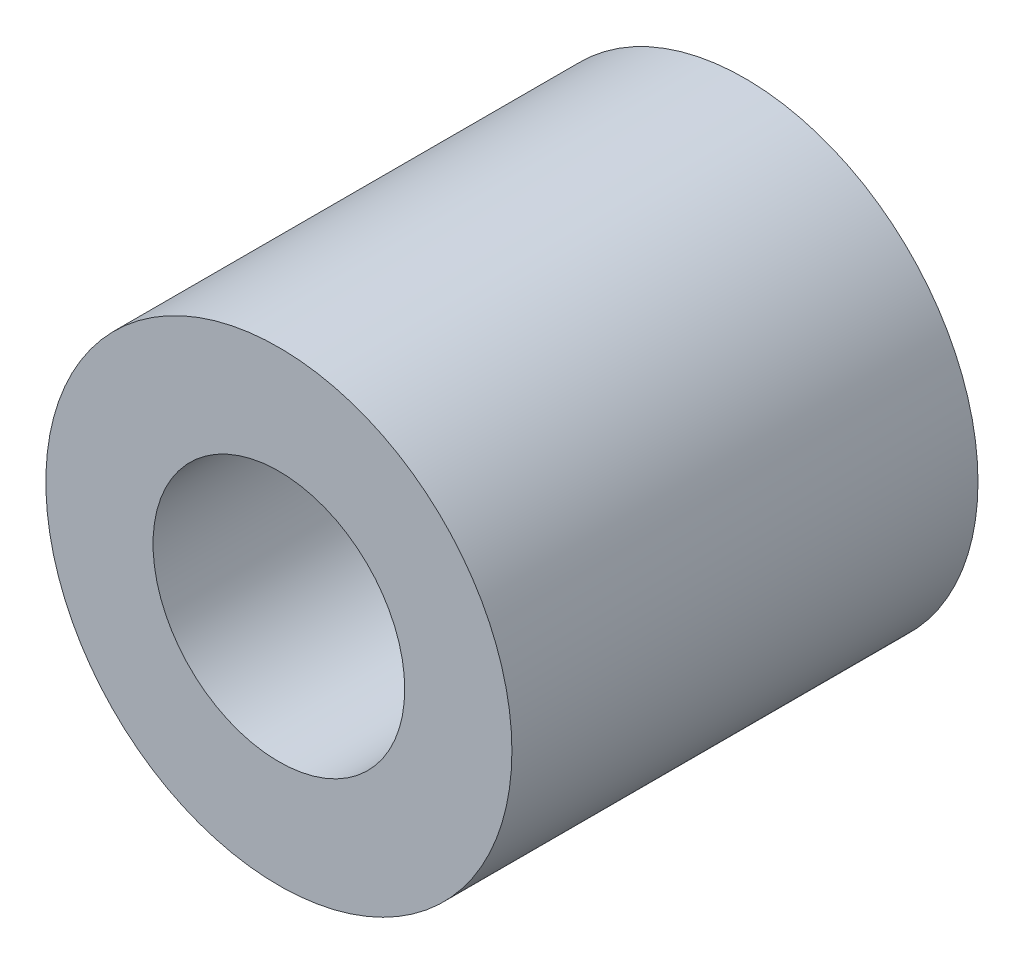
ISO-10303-21;
HEADER;
FILE_DESCRIPTION(('STEP AP214'),'2;1');
FILE_NAME('part.step','',(''),(''),'','','');
FILE_SCHEMA(('AUTOMOTIVE_DESIGN { 1 0 10303 214 1 1 1 1 }'));
ENDSEC;
DATA;
#1=APPLICATION_CONTEXT('core data for automotive mechanical design processes');
#2=APPLICATION_PROTOCOL_DEFINITION('international standard','automotive_design',2000,#1);
#3=PRODUCT_CONTEXT('',#1,'mechanical');
#4=PRODUCT('Part','Part','',(#3));
#5=PRODUCT_RELATED_PRODUCT_CATEGORY('part','',(#4));
#6=PRODUCT_DEFINITION_FORMATION('','',#4);
#7=PRODUCT_DEFINITION_CONTEXT('part definition',#1,'design');
#8=PRODUCT_DEFINITION('design','',#6,#7);
#9=PRODUCT_DEFINITION_SHAPE('','',#8);
#10=(LENGTH_UNIT() NAMED_UNIT(*) SI_UNIT(.MILLI.,.METRE.));
#11=(NAMED_UNIT(*) PLANE_ANGLE_UNIT() SI_UNIT($,.RADIAN.));
#12=(NAMED_UNIT(*) SI_UNIT($,.STERADIAN.) SOLID_ANGLE_UNIT());
#13=UNCERTAINTY_MEASURE_WITH_UNIT(LENGTH_MEASURE(1.E-05),#10,'distance_accuracy_value','');
#14=(GEOMETRIC_REPRESENTATION_CONTEXT(3) GLOBAL_UNCERTAINTY_ASSIGNED_CONTEXT((#13)) GLOBAL_UNIT_ASSIGNED_CONTEXT((#10,
#11,#12)) REPRESENTATION_CONTEXT('',''));
#15=CARTESIAN_POINT('',(0.,0.,0.));
#16=DIRECTION('',(0.,0.,1.));
#17=DIRECTION('',(1.,0.,0.));
#18=AXIS2_PLACEMENT_3D('',#15,#16,#17);
#19=CARTESIAN_POINT('',(0.,0.,5.));
#20=DIRECTION('',(0.,0.,1.));
#21=DIRECTION('',(1.,0.,0.));
#22=AXIS2_PLACEMENT_3D('',#19,#20,#21);
#23=PLANE('',#22);
#24=CARTESIAN_POINT('',(0.,0.,5.));
#25=DIRECTION('',(0.,0.,1.));
#26=DIRECTION('',(1.,0.,0.));
#27=AXIS2_PLACEMENT_3D('',#24,#25,#26);
#28=CIRCLE('',#27,2.5);
#29=CARTESIAN_POINT('',(2.5,0.,5.));
#30=VERTEX_POINT('',#29);
#31=EDGE_CURVE('E10',#30,#30,#28,.T.);
#32=ORIENTED_EDGE('',*,*,#31,.T.);
#33=EDGE_LOOP('',(#32));
#34=FACE_BOUND('',#33,.T.);
#35=CARTESIAN_POINT('',(0.,0.,5.));
#36=DIRECTION('',(0.,0.,1.));
#37=DIRECTION('',(1.,0.,0.));
#38=AXIS2_PLACEMENT_3D('',#35,#36,#37);
#39=CIRCLE('',#38,1.35);
#40=CARTESIAN_POINT('',(1.35,0.,5.));
#41=VERTEX_POINT('',#40);
#42=EDGE_CURVE('E44',#41,#41,#39,.T.);
#43=ORIENTED_EDGE('',*,*,#42,.F.);
#44=EDGE_LOOP('',(#43));
#45=FACE_BOUND('',#44,.T.);
#46=ADVANCED_FACE('F33',(#34,#45),#23,.T.);
#47=CARTESIAN_POINT('',(0.,0.,0.));
#48=DIRECTION('',(0.,0.,1.));
#49=DIRECTION('',(1.,0.,0.));
#50=AXIS2_PLACEMENT_3D('',#47,#48,#49);
#51=PLANE('',#50);
#52=CARTESIAN_POINT('',(0.,0.,0.));
#53=DIRECTION('',(0.,0.,1.));
#54=DIRECTION('',(1.,0.,0.));
#55=AXIS2_PLACEMENT_3D('',#52,#53,#54);
#56=CIRCLE('',#55,2.5);
#57=CARTESIAN_POINT('',(2.5,0.,0.));
#58=VERTEX_POINT('',#57);
#59=EDGE_CURVE('E37',#58,#58,#56,.T.);
#60=ORIENTED_EDGE('',*,*,#59,.F.);
#61=EDGE_LOOP('',(#60));
#62=FACE_BOUND('',#61,.T.);
#63=CARTESIAN_POINT('',(0.,0.,0.));
#64=DIRECTION('',(0.,0.,1.));
#65=DIRECTION('',(1.,0.,0.));
#66=AXIS2_PLACEMENT_3D('',#63,#64,#65);
#67=CIRCLE('',#66,1.35);
#68=CARTESIAN_POINT('',(1.35,0.,0.));
#69=VERTEX_POINT('',#68);
#70=EDGE_CURVE('E46',#69,#69,#67,.T.);
#71=ORIENTED_EDGE('',*,*,#70,.T.);
#72=EDGE_LOOP('',(#71));
#73=FACE_BOUND('',#72,.T.);
#74=ADVANCED_FACE('F56',(#62,#73),#51,.F.);
#75=CARTESIAN_POINT('',(0.,0.,5.));
#76=DIRECTION('',(0.,0.,-1.));
#77=DIRECTION('',(-1.,0.,0.));
#78=AXIS2_PLACEMENT_3D('',#75,#76,#77);
#79=CYLINDRICAL_SURFACE('',#78,2.5);
#80=ORIENTED_EDGE('',*,*,#31,.F.);
#81=EDGE_LOOP('',(#80));
#82=FACE_BOUND('',#81,.T.);
#83=ORIENTED_EDGE('',*,*,#59,.T.);
#84=EDGE_LOOP('',(#83));
#85=FACE_BOUND('',#84,.T.);
#86=ADVANCED_FACE('F35',(#82,#85),#79,.T.);
#87=CARTESIAN_POINT('',(0.,0.,5.));
#88=DIRECTION('',(0.,0.,-1.));
#89=DIRECTION('',(-1.,0.,0.));
#90=AXIS2_PLACEMENT_3D('',#87,#88,#89);
#91=CYLINDRICAL_SURFACE('',#90,1.35);
#92=ORIENTED_EDGE('',*,*,#42,.T.);
#93=EDGE_LOOP('',(#92));
#94=FACE_BOUND('',#93,.T.);
#95=ORIENTED_EDGE('',*,*,#70,.F.);
#96=EDGE_LOOP('',(#95));
#97=FACE_BOUND('',#96,.T.);
#98=ADVANCED_FACE('F52',(#94,#97),#91,.F.);
#99=CLOSED_SHELL('',(#46,#74,#86,#98));
#100=MANIFOLD_SOLID_BREP('B2',#99);
#101=ADVANCED_BREP_SHAPE_REPRESENTATION('',(#18,#100),#14);
#102=SHAPE_DEFINITION_REPRESENTATION(#9,#101);
ENDSEC;
END-ISO-10303-21;
